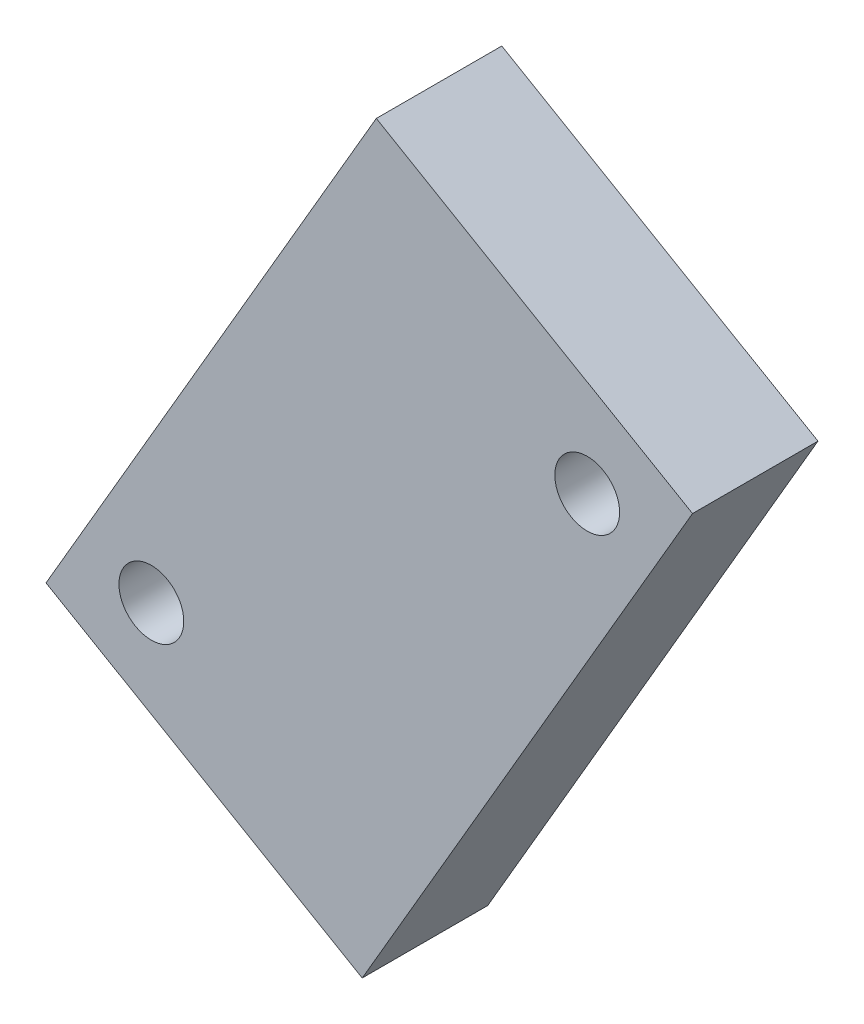
ISO-10303-21;
HEADER;
FILE_DESCRIPTION(('STEP AP214'),'2;1');
FILE_NAME('part.step','',(''),(''),'','','');
FILE_SCHEMA(('AUTOMOTIVE_DESIGN { 1 0 10303 214 1 1 1 1 }'));
ENDSEC;
DATA;
#1=APPLICATION_CONTEXT('core data for automotive mechanical design processes');
#2=APPLICATION_PROTOCOL_DEFINITION('international standard','automotive_design',2000,#1);
#3=PRODUCT_CONTEXT('',#1,'mechanical');
#4=PRODUCT('Part','Part','',(#3));
#5=PRODUCT_RELATED_PRODUCT_CATEGORY('part','',(#4));
#6=PRODUCT_DEFINITION_FORMATION('','',#4);
#7=PRODUCT_DEFINITION_CONTEXT('part definition',#1,'design');
#8=PRODUCT_DEFINITION('design','',#6,#7);
#9=PRODUCT_DEFINITION_SHAPE('','',#8);
#10=(LENGTH_UNIT() NAMED_UNIT(*) SI_UNIT(.MILLI.,.METRE.));
#11=(NAMED_UNIT(*) PLANE_ANGLE_UNIT() SI_UNIT($,.RADIAN.));
#12=(NAMED_UNIT(*) SI_UNIT($,.STERADIAN.) SOLID_ANGLE_UNIT());
#13=UNCERTAINTY_MEASURE_WITH_UNIT(LENGTH_MEASURE(1.E-05),#10,'distance_accuracy_value','');
#14=(GEOMETRIC_REPRESENTATION_CONTEXT(3) GLOBAL_UNCERTAINTY_ASSIGNED_CONTEXT((#13)) GLOBAL_UNIT_ASSIGNED_CONTEXT((#10,
#11,#12)) REPRESENTATION_CONTEXT('',''));
#15=CARTESIAN_POINT('',(0.,0.,0.));
#16=DIRECTION('',(0.,0.,1.));
#17=DIRECTION('',(1.,0.,0.));
#18=AXIS2_PLACEMENT_3D('',#15,#16,#17);
#19=CARTESIAN_POINT('',(453.297070619608,64.575514038034,6.));
#20=DIRECTION('',(0.864231753231351,-0.503093904461846,0.));
#21=DIRECTION('',(0.503093904461846,0.864231753231351,0.));
#22=AXIS2_PLACEMENT_3D('',#19,#20,#21);
#23=PLANE('',#22);
#24=DIRECTION('',(-0.503093904461846,-0.864231753231351,0.));
#25=VECTOR('',#24,1.);
#26=CARTESIAN_POINT('',(453.297070619608,64.575514038034,0.));
#27=LINE('',#26,#25);
#28=CARTESIAN_POINT('',(453.297070619608,64.575514038034,0.));
#29=VERTEX_POINT('',#28);
#30=CARTESIAN_POINT('',(437.499922019506,37.4386369865696,0.));
#31=VERTEX_POINT('',#30);
#32=EDGE_CURVE('E111',#29,#31,#27,.T.);
#33=ORIENTED_EDGE('',*,*,#32,.T.);
#34=DIRECTION('',(0.,0.,-1.));
#35=VECTOR('',#34,1.);
#36=CARTESIAN_POINT('',(437.499922019506,37.4386369865696,6.));
#37=LINE('',#36,#35);
#38=CARTESIAN_POINT('',(437.499922019506,37.4386369865696,6.));
#39=VERTEX_POINT('',#38);
#40=EDGE_CURVE('E11',#39,#31,#37,.T.);
#41=ORIENTED_EDGE('',*,*,#40,.F.);
#42=DIRECTION('',(-0.503093904461846,-0.864231753231351,0.));
#43=VECTOR('',#42,1.);
#44=CARTESIAN_POINT('',(453.297070619608,64.575514038034,6.));
#45=LINE('',#44,#43);
#46=CARTESIAN_POINT('',(453.297070619608,64.575514038034,6.));
#47=VERTEX_POINT('',#46);
#48=EDGE_CURVE('E93',#47,#39,#45,.T.);
#49=ORIENTED_EDGE('',*,*,#48,.F.);
#50=DIRECTION('',(0.,0.,-1.));
#51=VECTOR('',#50,1.);
#52=CARTESIAN_POINT('',(453.297070619608,64.575514038034,6.));
#53=LINE('',#52,#51);
#54=EDGE_CURVE('E107',#47,#29,#53,.T.);
#55=ORIENTED_EDGE('',*,*,#54,.T.);
#56=EDGE_LOOP('',(#33,#41,#49,#55));
#57=FACE_BOUND('',#56,.T.);
#58=ADVANCED_FACE('F38',(#57),#23,.F.);
#59=CARTESIAN_POINT('',(437.499922019506,37.4386369865696,6.));
#60=DIRECTION('',(0.503093904461847,0.86423175323135,0.));
#61=DIRECTION('',(-0.86423175323135,0.503093904461847,0.));
#62=AXIS2_PLACEMENT_3D('',#59,#60,#61);
#63=PLANE('',#62);
#64=DIRECTION('',(0.86423175323135,-0.503093904461847,0.));
#65=VECTOR('',#64,1.);
#66=CARTESIAN_POINT('',(437.499922019506,37.4386369865696,0.));
#67=LINE('',#66,#65);
#68=CARTESIAN_POINT('',(452.623977701055,28.6344936584872,0.));
#69=VERTEX_POINT('',#68);
#70=EDGE_CURVE('E98',#31,#69,#67,.T.);
#71=ORIENTED_EDGE('',*,*,#70,.T.);
#72=DIRECTION('',(0.,0.,-1.));
#73=VECTOR('',#72,1.);
#74=CARTESIAN_POINT('',(452.623977701055,28.6344936584872,6.));
#75=LINE('',#74,#73);
#76=CARTESIAN_POINT('',(452.623977701055,28.6344936584872,6.));
#77=VERTEX_POINT('',#76);
#78=EDGE_CURVE('E46',#77,#69,#75,.T.);
#79=ORIENTED_EDGE('',*,*,#78,.F.);
#80=DIRECTION('',(0.86423175323135,-0.503093904461847,0.));
#81=VECTOR('',#80,1.);
#82=CARTESIAN_POINT('',(437.499922019506,37.4386369865696,6.));
#83=LINE('',#82,#81);
#84=EDGE_CURVE('E88',#39,#77,#83,.T.);
#85=ORIENTED_EDGE('',*,*,#84,.F.);
#86=ORIENTED_EDGE('',*,*,#40,.T.);
#87=EDGE_LOOP('',(#71,#79,#85,#86));
#88=FACE_BOUND('',#87,.T.);
#89=ADVANCED_FACE('F97',(#88),#63,.F.);
#90=CARTESIAN_POINT('',(452.623977701055,28.6344936584872,6.));
#91=DIRECTION('',(-0.864231753231349,0.503093904461849,0.));
#92=DIRECTION('',(-0.503093904461849,-0.864231753231349,0.));
#93=AXIS2_PLACEMENT_3D('',#90,#91,#92);
#94=PLANE('',#93);
#95=DIRECTION('',(0.503093904461849,0.864231753231349,0.));
#96=VECTOR('',#95,1.);
#97=CARTESIAN_POINT('',(452.623977701055,28.6344936584872,0.));
#98=LINE('',#97,#96);
#99=CARTESIAN_POINT('',(468.421126301157,55.7713707099516,0.));
#100=VERTEX_POINT('',#99);
#101=EDGE_CURVE('E74',#69,#100,#98,.T.);
#102=ORIENTED_EDGE('',*,*,#101,.T.);
#103=DIRECTION('',(0.,0.,-1.));
#104=VECTOR('',#103,1.);
#105=CARTESIAN_POINT('',(468.421126301157,55.7713707099516,6.));
#106=LINE('',#105,#104);
#107=CARTESIAN_POINT('',(468.421126301157,55.7713707099516,6.));
#108=VERTEX_POINT('',#107);
#109=EDGE_CURVE('E100',#108,#100,#106,.T.);
#110=ORIENTED_EDGE('',*,*,#109,.F.);
#111=DIRECTION('',(0.503093904461849,0.864231753231349,0.));
#112=VECTOR('',#111,1.);
#113=CARTESIAN_POINT('',(452.623977701055,28.6344936584872,6.));
#114=LINE('',#113,#112);
#115=EDGE_CURVE('E91',#77,#108,#114,.T.);
#116=ORIENTED_EDGE('',*,*,#115,.F.);
#117=ORIENTED_EDGE('',*,*,#78,.T.);
#118=EDGE_LOOP('',(#102,#110,#116,#117));
#119=FACE_BOUND('',#118,.T.);
#120=ADVANCED_FACE('F101',(#119),#94,.F.);
#121=CARTESIAN_POINT('',(468.421126301157,55.7713707099516,6.));
#122=DIRECTION('',(-0.503093904461845,-0.864231753231352,0.));
#123=DIRECTION('',(0.864231753231352,-0.503093904461845,0.));
#124=AXIS2_PLACEMENT_3D('',#121,#122,#123);
#125=PLANE('',#124);
#126=DIRECTION('',(-0.864231753231352,0.503093904461845,0.));
#127=VECTOR('',#126,1.);
#128=CARTESIAN_POINT('',(468.421126301157,55.7713707099516,0.));
#129=LINE('',#128,#127);
#130=EDGE_CURVE('E81',#100,#29,#129,.T.);
#131=ORIENTED_EDGE('',*,*,#130,.T.);
#132=ORIENTED_EDGE('',*,*,#54,.F.);
#133=DIRECTION('',(-0.864231753231352,0.503093904461845,0.));
#134=VECTOR('',#133,1.);
#135=CARTESIAN_POINT('',(468.421126301157,55.7713707099516,6.));
#136=LINE('',#135,#134);
#137=EDGE_CURVE('E56',#108,#47,#136,.T.);
#138=ORIENTED_EDGE('',*,*,#137,.F.);
#139=ORIENTED_EDGE('',*,*,#109,.T.);
#140=EDGE_LOOP('',(#131,#132,#138,#139));
#141=FACE_BOUND('',#140,.T.);
#142=ADVANCED_FACE('F123',(#141),#125,.F.);
#143=CARTESIAN_POINT('',(0.,0.,6.));
#144=DIRECTION('',(0.,0.,1.));
#145=DIRECTION('',(1.,0.,0.));
#146=AXIS2_PLACEMENT_3D('',#143,#144,#145);
#147=PLANE('',#146);
#148=CARTESIAN_POINT('',(442.537108773663,39.1347353338785,6.));
#149=DIRECTION('',(0.,0.,1.));
#150=DIRECTION('',(1.,0.,0.));
#151=AXIS2_PLACEMENT_3D('',#148,#149,#150);
#152=CIRCLE('',#151,1.54999999999999);
#153=CARTESIAN_POINT('',(444.087108773663,39.1347353338785,6.));
#154=VERTEX_POINT('',#153);
#155=EDGE_CURVE('E138',#154,#154,#152,.T.);
#156=ORIENTED_EDGE('',*,*,#155,.F.);
#157=EDGE_LOOP('',(#156));
#158=FACE_BOUND('',#157,.T.);
#159=CARTESIAN_POINT('',(463.383939547,54.0752723626427,6.));
#160=DIRECTION('',(0.,0.,1.));
#161=DIRECTION('',(1.,0.,0.));
#162=AXIS2_PLACEMENT_3D('',#159,#160,#161);
#163=CIRCLE('',#162,1.54999999999999);
#164=CARTESIAN_POINT('',(464.933939547,54.0752723626427,6.));
#165=VERTEX_POINT('',#164);
#166=EDGE_CURVE('E130',#165,#165,#163,.T.);
#167=ORIENTED_EDGE('',*,*,#166,.F.);
#168=EDGE_LOOP('',(#167));
#169=FACE_BOUND('',#168,.T.);
#170=ORIENTED_EDGE('',*,*,#48,.T.);
#171=ORIENTED_EDGE('',*,*,#84,.T.);
#172=ORIENTED_EDGE('',*,*,#115,.T.);
#173=ORIENTED_EDGE('',*,*,#137,.T.);
#174=EDGE_LOOP('',(#170,#171,#172,#173));
#175=FACE_BOUND('',#174,.T.);
#176=ADVANCED_FACE('F89',(#158,#169,#175),#147,.T.);
#177=CARTESIAN_POINT('',(0.,0.,0.));
#178=DIRECTION('',(0.,0.,1.));
#179=DIRECTION('',(1.,0.,0.));
#180=AXIS2_PLACEMENT_3D('',#177,#178,#179);
#181=PLANE('',#180);
#182=CARTESIAN_POINT('',(442.537108773663,39.1347353338785,0.));
#183=DIRECTION('',(0.,0.,1.));
#184=DIRECTION('',(1.,0.,0.));
#185=AXIS2_PLACEMENT_3D('',#182,#183,#184);
#186=CIRCLE('',#185,1.54999999999999);
#187=CARTESIAN_POINT('',(444.087108773663,39.1347353338785,0.));
#188=VERTEX_POINT('',#187);
#189=EDGE_CURVE('E134',#188,#188,#186,.T.);
#190=ORIENTED_EDGE('',*,*,#189,.T.);
#191=EDGE_LOOP('',(#190));
#192=FACE_BOUND('',#191,.T.);
#193=CARTESIAN_POINT('',(463.383939547,54.0752723626427,0.));
#194=DIRECTION('',(0.,0.,1.));
#195=DIRECTION('',(1.,0.,0.));
#196=AXIS2_PLACEMENT_3D('',#193,#194,#195);
#197=CIRCLE('',#196,1.54999999999999);
#198=CARTESIAN_POINT('',(464.933939547,54.0752723626427,0.));
#199=VERTEX_POINT('',#198);
#200=EDGE_CURVE('E115',#199,#199,#197,.T.);
#201=ORIENTED_EDGE('',*,*,#200,.T.);
#202=EDGE_LOOP('',(#201));
#203=FACE_BOUND('',#202,.T.);
#204=ORIENTED_EDGE('',*,*,#32,.F.);
#205=ORIENTED_EDGE('',*,*,#130,.F.);
#206=ORIENTED_EDGE('',*,*,#101,.F.);
#207=ORIENTED_EDGE('',*,*,#70,.F.);
#208=EDGE_LOOP('',(#204,#205,#206,#207));
#209=FACE_BOUND('',#208,.T.);
#210=ADVANCED_FACE('F126',(#192,#203,#209),#181,.F.);
#211=CARTESIAN_POINT('',(463.383939547,54.0752723626427,0.));
#212=DIRECTION('',(0.,0.,1.));
#213=DIRECTION('',(1.,0.,0.));
#214=AXIS2_PLACEMENT_3D('',#211,#212,#213);
#215=CYLINDRICAL_SURFACE('',#214,1.54999999999999);
#216=ORIENTED_EDGE('',*,*,#200,.F.);
#217=EDGE_LOOP('',(#216));
#218=FACE_BOUND('',#217,.T.);
#219=ORIENTED_EDGE('',*,*,#166,.T.);
#220=EDGE_LOOP('',(#219));
#221=FACE_BOUND('',#220,.T.);
#222=ADVANCED_FACE('F150',(#218,#221),#215,.F.);
#223=CARTESIAN_POINT('',(442.537108773663,39.1347353338785,0.));
#224=DIRECTION('',(0.,0.,1.));
#225=DIRECTION('',(1.,0.,0.));
#226=AXIS2_PLACEMENT_3D('',#223,#224,#225);
#227=CYLINDRICAL_SURFACE('',#226,1.54999999999999);
#228=ORIENTED_EDGE('',*,*,#189,.F.);
#229=EDGE_LOOP('',(#228));
#230=FACE_BOUND('',#229,.T.);
#231=ORIENTED_EDGE('',*,*,#155,.T.);
#232=EDGE_LOOP('',(#231));
#233=FACE_BOUND('',#232,.T.);
#234=ADVANCED_FACE('F147',(#230,#233),#227,.F.);
#235=CLOSED_SHELL('',(#58,#89,#120,#142,#176,#210,#222,#234));
#236=MANIFOLD_SOLID_BREP('B2',#235);
#237=ADVANCED_BREP_SHAPE_REPRESENTATION('',(#18,#236),#14);
#238=SHAPE_DEFINITION_REPRESENTATION(#9,#237);
ENDSEC;
END-ISO-10303-21;
